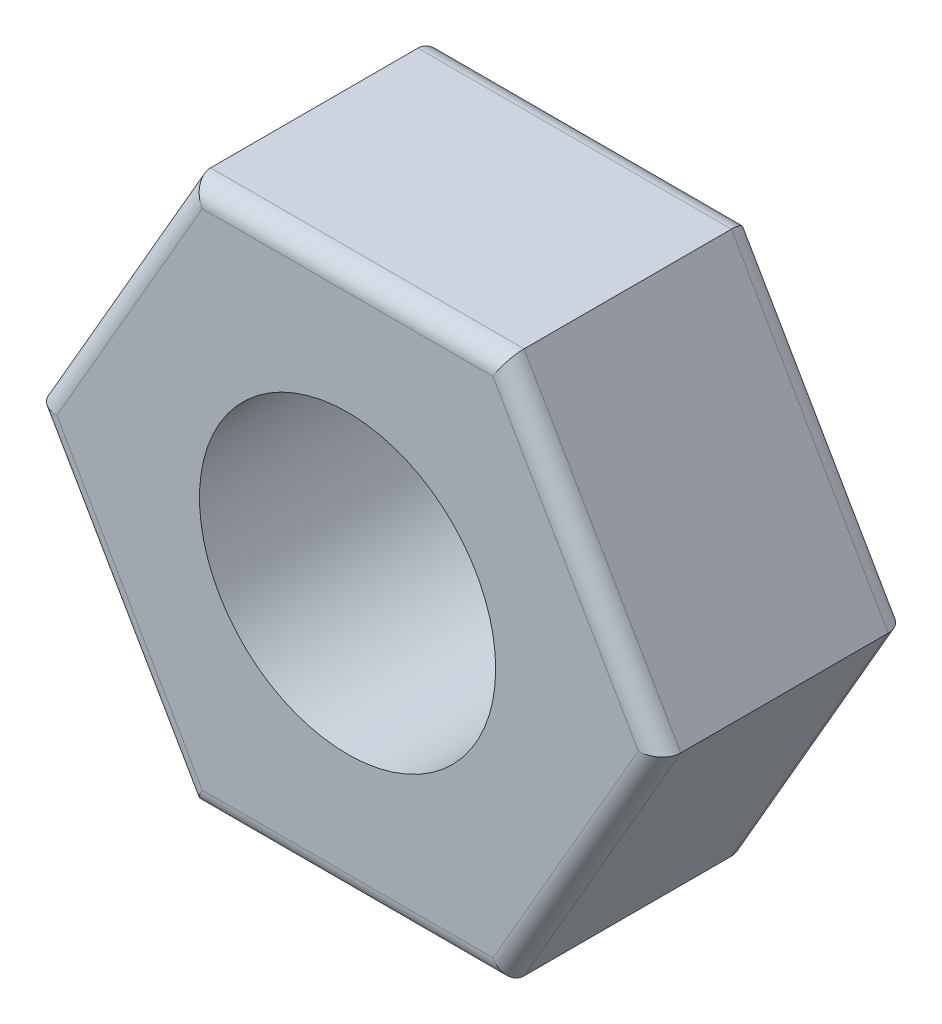
ISO-10303-21;
HEADER;
FILE_DESCRIPTION(('STEP AP214'),'2;1');
FILE_NAME('part.step','',(''),(''),'','','');
FILE_SCHEMA(('AUTOMOTIVE_DESIGN { 1 0 10303 214 1 1 1 1 }'));
ENDSEC;
DATA;
#1=APPLICATION_CONTEXT('core data for automotive mechanical design processes');
#2=APPLICATION_PROTOCOL_DEFINITION('international standard','automotive_design',2000,#1);
#3=PRODUCT_CONTEXT('',#1,'mechanical');
#4=PRODUCT('Part','Part','',(#3));
#5=PRODUCT_RELATED_PRODUCT_CATEGORY('part','',(#4));
#6=PRODUCT_DEFINITION_FORMATION('','',#4);
#7=PRODUCT_DEFINITION_CONTEXT('part definition',#1,'design');
#8=PRODUCT_DEFINITION('design','',#6,#7);
#9=PRODUCT_DEFINITION_SHAPE('','',#8);
#10=(LENGTH_UNIT() NAMED_UNIT(*) SI_UNIT(.MILLI.,.METRE.));
#11=(NAMED_UNIT(*) PLANE_ANGLE_UNIT() SI_UNIT($,.RADIAN.));
#12=(NAMED_UNIT(*) SI_UNIT($,.STERADIAN.) SOLID_ANGLE_UNIT());
#13=UNCERTAINTY_MEASURE_WITH_UNIT(LENGTH_MEASURE(1.E-05),#10,'distance_accuracy_value','');
#14=(GEOMETRIC_REPRESENTATION_CONTEXT(3) GLOBAL_UNCERTAINTY_ASSIGNED_CONTEXT((#13)) GLOBAL_UNIT_ASSIGNED_CONTEXT((#10,
#11,#12)) REPRESENTATION_CONTEXT('',''));
#15=CARTESIAN_POINT('',(0.,0.,0.));
#16=DIRECTION('',(0.,0.,1.));
#17=DIRECTION('',(1.,0.,0.));
#18=AXIS2_PLACEMENT_3D('',#15,#16,#17);
#19=CARTESIAN_POINT('',(0.,0.,2.5));
#20=DIRECTION('',(0.,0.,1.));
#21=DIRECTION('',(1.,0.,0.));
#22=AXIS2_PLACEMENT_3D('',#19,#20,#21);
#23=PLANE('',#22);
#24=DIRECTION('',(-0.5,-0.866025403784439,0.));
#25=VECTOR('',#24,1.);
#26=CARTESIAN_POINT('',(-3.00222139978605,-0.1,2.5));
#27=LINE('',#26,#25);
#28=CARTESIAN_POINT('',(-1.47224318643355,2.55,2.5));
#29=VERTEX_POINT('',#28);
#30=CARTESIAN_POINT('',(-2.94448637286709,0.,2.5));
#31=VERTEX_POINT('',#30);
#32=EDGE_CURVE('E161',#29,#31,#27,.T.);
#33=ORIENTED_EDGE('',*,*,#32,.T.);
#34=DIRECTION('',(0.5,-0.866025403784439,0.));
#35=VECTOR('',#34,1.);
#36=CARTESIAN_POINT('',(-1.41450815951458,-2.65,2.5));
#37=LINE('',#36,#35);
#38=CARTESIAN_POINT('',(-1.47224318643354,-2.55,2.5));
#39=VERTEX_POINT('',#38);
#40=EDGE_CURVE('E140',#31,#39,#37,.T.);
#41=ORIENTED_EDGE('',*,*,#40,.T.);
#42=DIRECTION('',(1.,0.,0.));
#43=VECTOR('',#42,1.);
#44=CARTESIAN_POINT('',(1.58771324027147,-2.55,2.5));
#45=LINE('',#44,#43);
#46=CARTESIAN_POINT('',(1.47224318643354,-2.55,2.5));
#47=VERTEX_POINT('',#46);
#48=EDGE_CURVE('E149',#39,#47,#45,.T.);
#49=ORIENTED_EDGE('',*,*,#48,.T.);
#50=DIRECTION('',(0.5,0.866025403784439,0.));
#51=VECTOR('',#50,1.);
#52=CARTESIAN_POINT('',(3.00222139978605,0.0999999999999998,2.5));
#53=LINE('',#52,#51);
#54=CARTESIAN_POINT('',(2.94448637286709,0.,2.5));
#55=VERTEX_POINT('',#54);
#56=EDGE_CURVE('E156',#47,#55,#53,.T.);
#57=ORIENTED_EDGE('',*,*,#56,.T.);
#58=DIRECTION('',(-0.5,0.866025403784439,0.));
#59=VECTOR('',#58,1.);
#60=CARTESIAN_POINT('',(1.41450815951458,2.65,2.5));
#61=LINE('',#60,#59);
#62=CARTESIAN_POINT('',(1.47224318643354,2.55,2.5));
#63=VERTEX_POINT('',#62);
#64=EDGE_CURVE('E301',#55,#63,#61,.T.);
#65=ORIENTED_EDGE('',*,*,#64,.T.);
#66=DIRECTION('',(-1.,0.,0.));
#67=VECTOR('',#66,1.);
#68=CARTESIAN_POINT('',(-1.58771324027147,2.55,2.5));
#69=LINE('',#68,#67);
#70=EDGE_CURVE('E169',#63,#29,#69,.T.);
#71=ORIENTED_EDGE('',*,*,#70,.T.);
#72=EDGE_LOOP('',(#33,#41,#49,#57,#65,#71));
#73=FACE_BOUND('',#72,.T.);
#74=CARTESIAN_POINT('',(0.,0.,2.5));
#75=DIRECTION('',(0.,0.,1.));
#76=DIRECTION('',(1.,0.,0.));
#77=AXIS2_PLACEMENT_3D('',#74,#75,#76);
#78=CIRCLE('',#77,1.5);
#79=CARTESIAN_POINT('',(1.5,0.,2.5));
#80=VERTEX_POINT('',#79);
#81=EDGE_CURVE('E241',#80,#80,#78,.T.);
#82=ORIENTED_EDGE('',*,*,#81,.F.);
#83=EDGE_LOOP('',(#82));
#84=FACE_BOUND('',#83,.T.);
#85=ADVANCED_FACE('F43',(#73,#84),#23,.T.);
#86=CARTESIAN_POINT('',(0.,0.,0.));
#87=DIRECTION('',(0.,0.,1.));
#88=DIRECTION('',(1.,0.,0.));
#89=AXIS2_PLACEMENT_3D('',#86,#87,#88);
#90=PLANE('',#89);
#91=CARTESIAN_POINT('',(0.,0.,0.));
#92=DIRECTION('',(0.,0.,1.));
#93=DIRECTION('',(1.,0.,0.));
#94=AXIS2_PLACEMENT_3D('',#91,#92,#93);
#95=CIRCLE('',#94,1.7);
#96=CARTESIAN_POINT('',(1.7,0.,0.));
#97=VERTEX_POINT('',#96);
#98=EDGE_CURVE('E53',#97,#97,#95,.T.);
#99=ORIENTED_EDGE('',*,*,#98,.T.);
#100=EDGE_LOOP('',(#99));
#101=FACE_BOUND('',#100,.T.);
#102=DIRECTION('',(-0.5,0.866025403784439,0.));
#103=VECTOR('',#102,1.);
#104=CARTESIAN_POINT('',(2.20836477965032,1.275,0.));
#105=LINE('',#104,#103);
#106=CARTESIAN_POINT('',(1.47224318643354,2.55,0.));
#107=VERTEX_POINT('',#106);
#108=CARTESIAN_POINT('',(2.94448637286709,0.,0.));
#109=VERTEX_POINT('',#108);
#110=EDGE_CURVE('E61',#107,#109,#105,.F.);
#111=ORIENTED_EDGE('',*,*,#110,.T.);
#112=DIRECTION('',(0.5,0.866025403784439,0.));
#113=VECTOR('',#112,1.);
#114=CARTESIAN_POINT('',(2.20836477965032,-1.275,0.));
#115=LINE('',#114,#113);
#116=CARTESIAN_POINT('',(1.47224318643354,-2.55,0.));
#117=VERTEX_POINT('',#116);
#118=EDGE_CURVE('E219',#109,#117,#115,.F.);
#119=ORIENTED_EDGE('',*,*,#118,.T.);
#120=DIRECTION('',(1.,0.,0.));
#121=VECTOR('',#120,1.);
#122=CARTESIAN_POINT('',(0.,-2.55,0.));
#123=LINE('',#122,#121);
#124=CARTESIAN_POINT('',(-1.47224318643355,-2.55,0.));
#125=VERTEX_POINT('',#124);
#126=EDGE_CURVE('E206',#117,#125,#123,.F.);
#127=ORIENTED_EDGE('',*,*,#126,.T.);
#128=DIRECTION('',(0.5,-0.866025403784439,0.));
#129=VECTOR('',#128,1.);
#130=CARTESIAN_POINT('',(-2.20836477965032,-1.275,0.));
#131=LINE('',#130,#129);
#132=CARTESIAN_POINT('',(-2.94448637286709,0.,0.));
#133=VERTEX_POINT('',#132);
#134=EDGE_CURVE('E209',#125,#133,#131,.F.);
#135=ORIENTED_EDGE('',*,*,#134,.T.);
#136=DIRECTION('',(-0.5,-0.866025403784439,0.));
#137=VECTOR('',#136,1.);
#138=CARTESIAN_POINT('',(-2.20836477965032,1.275,0.));
#139=LINE('',#138,#137);
#140=CARTESIAN_POINT('',(-1.47224318643355,2.55,0.));
#141=VERTEX_POINT('',#140);
#142=EDGE_CURVE('E212',#133,#141,#139,.F.);
#143=ORIENTED_EDGE('',*,*,#142,.T.);
#144=DIRECTION('',(-1.,0.,0.));
#145=VECTOR('',#144,1.);
#146=CARTESIAN_POINT('',(0.,2.55,0.));
#147=LINE('',#146,#145);
#148=EDGE_CURVE('E66',#141,#107,#147,.F.);
#149=ORIENTED_EDGE('',*,*,#148,.T.);
#150=EDGE_LOOP('',(#111,#119,#127,#135,#143,#149));
#151=FACE_BOUND('',#150,.T.);
#152=ADVANCED_FACE('F272',(#101,#151),#90,.F.);
#153=CARTESIAN_POINT('',(-1.58771324027147,-2.75,2.5));
#154=DIRECTION('',(0.,1.,0.));
#155=DIRECTION('',(0.,0.,1.));
#156=AXIS2_PLACEMENT_3D('',#153,#154,#155);
#157=PLANE('',#156);
#158=DIRECTION('',(0.,0.,-1.));
#159=VECTOR('',#158,1.);
#160=CARTESIAN_POINT('',(1.58771324027147,-2.75,2.5));
#161=LINE('',#160,#159);
#162=CARTESIAN_POINT('',(1.58771324027147,-2.75,2.3));
#163=VERTEX_POINT('',#162);
#164=CARTESIAN_POINT('',(1.58771324027147,-2.75,0.2));
#165=VERTEX_POINT('',#164);
#166=EDGE_CURVE('E157',#163,#165,#161,.T.);
#167=ORIENTED_EDGE('',*,*,#166,.F.);
#168=DIRECTION('',(1.,0.,0.));
#169=VECTOR('',#168,1.);
#170=CARTESIAN_POINT('',(-1.58771324027147,-2.75,2.3));
#171=LINE('',#170,#169);
#172=CARTESIAN_POINT('',(-1.58771324027147,-2.75,2.3));
#173=VERTEX_POINT('',#172);
#174=EDGE_CURVE('E203',#163,#173,#171,.F.);
#175=ORIENTED_EDGE('',*,*,#174,.T.);
#176=DIRECTION('',(0.,0.,-1.));
#177=VECTOR('',#176,1.);
#178=CARTESIAN_POINT('',(-1.58771324027147,-2.75,2.5));
#179=LINE('',#178,#177);
#180=CARTESIAN_POINT('',(-1.58771324027147,-2.75,0.2));
#181=VERTEX_POINT('',#180);
#182=EDGE_CURVE('E285',#173,#181,#179,.T.);
#183=ORIENTED_EDGE('',*,*,#182,.T.);
#184=DIRECTION('',(1.,0.,0.));
#185=VECTOR('',#184,1.);
#186=CARTESIAN_POINT('',(-1.58771324027147,-2.75,0.2));
#187=LINE('',#186,#185);
#188=EDGE_CURVE('E200',#181,#165,#187,.T.);
#189=ORIENTED_EDGE('',*,*,#188,.T.);
#190=EDGE_LOOP('',(#167,#175,#183,#189));
#191=FACE_BOUND('',#190,.T.);
#192=ADVANCED_FACE('F283',(#191),#157,.F.);
#193=CARTESIAN_POINT('',(1.58771324027147,-2.75,2.5));
#194=DIRECTION('',(-0.866025403784439,0.5,0.));
#195=DIRECTION('',(-0.5,-0.866025403784439,0.));
#196=AXIS2_PLACEMENT_3D('',#193,#194,#195);
#197=PLANE('',#196);
#198=DIRECTION('',(0.,0.,-1.));
#199=VECTOR('',#198,1.);
#200=CARTESIAN_POINT('',(3.17542648054294,0.,2.5));
#201=LINE('',#200,#199);
#202=CARTESIAN_POINT('',(3.17542648054294,0.,2.3));
#203=VERTEX_POINT('',#202);
#204=CARTESIAN_POINT('',(3.17542648054294,0.,0.2));
#205=VERTEX_POINT('',#204);
#206=EDGE_CURVE('E292',#203,#205,#201,.T.);
#207=ORIENTED_EDGE('',*,*,#206,.F.);
#208=DIRECTION('',(0.5,0.866025403784439,0.));
#209=VECTOR('',#208,1.);
#210=CARTESIAN_POINT('',(1.58771324027147,-2.75,2.3));
#211=LINE('',#210,#209);
#212=EDGE_CURVE('E197',#203,#163,#211,.F.);
#213=ORIENTED_EDGE('',*,*,#212,.T.);
#214=ORIENTED_EDGE('',*,*,#166,.T.);
#215=DIRECTION('',(0.5,0.866025403784439,0.));
#216=VECTOR('',#215,1.);
#217=CARTESIAN_POINT('',(1.58771324027147,-2.75,0.2));
#218=LINE('',#217,#216);
#219=EDGE_CURVE('E193',#165,#205,#218,.T.);
#220=ORIENTED_EDGE('',*,*,#219,.T.);
#221=EDGE_LOOP('',(#207,#213,#214,#220));
#222=FACE_BOUND('',#221,.T.);
#223=ADVANCED_FACE('F288',(#222),#197,.F.);
#224=CARTESIAN_POINT('',(3.17542648054294,0.,2.5));
#225=DIRECTION('',(-0.866025403784439,-0.5,0.));
#226=DIRECTION('',(0.5,-0.866025403784439,0.));
#227=AXIS2_PLACEMENT_3D('',#224,#225,#226);
#228=PLANE('',#227);
#229=DIRECTION('',(0.,0.,-1.));
#230=VECTOR('',#229,1.);
#231=CARTESIAN_POINT('',(1.58771324027147,2.75,2.5));
#232=LINE('',#231,#230);
#233=CARTESIAN_POINT('',(1.58771324027147,2.75,2.3));
#234=VERTEX_POINT('',#233);
#235=CARTESIAN_POINT('',(1.58771324027147,2.75,0.2));
#236=VERTEX_POINT('',#235);
#237=EDGE_CURVE('E295',#234,#236,#232,.T.);
#238=ORIENTED_EDGE('',*,*,#237,.F.);
#239=DIRECTION('',(-0.5,0.866025403784439,0.));
#240=VECTOR('',#239,1.);
#241=CARTESIAN_POINT('',(3.17542648054294,0.,2.3));
#242=LINE('',#241,#240);
#243=EDGE_CURVE('E190',#234,#203,#242,.F.);
#244=ORIENTED_EDGE('',*,*,#243,.T.);
#245=ORIENTED_EDGE('',*,*,#206,.T.);
#246=DIRECTION('',(-0.5,0.866025403784439,0.));
#247=VECTOR('',#246,1.);
#248=CARTESIAN_POINT('',(3.17542648054294,0.,0.2));
#249=LINE('',#248,#247);
#250=EDGE_CURVE('E187',#205,#236,#249,.T.);
#251=ORIENTED_EDGE('',*,*,#250,.T.);
#252=EDGE_LOOP('',(#238,#244,#245,#251));
#253=FACE_BOUND('',#252,.T.);
#254=ADVANCED_FACE('F368',(#253),#228,.F.);
#255=CARTESIAN_POINT('',(1.58771324027147,2.75,2.5));
#256=DIRECTION('',(0.,-1.,0.));
#257=DIRECTION('',(1.,0.,0.));
#258=AXIS2_PLACEMENT_3D('',#255,#256,#257);
#259=PLANE('',#258);
#260=DIRECTION('',(0.,0.,-1.));
#261=VECTOR('',#260,1.);
#262=CARTESIAN_POINT('',(-1.58771324027147,2.75,2.5));
#263=LINE('',#262,#261);
#264=CARTESIAN_POINT('',(-1.58771324027147,2.75,2.3));
#265=VERTEX_POINT('',#264);
#266=CARTESIAN_POINT('',(-1.58771324027147,2.75,0.2));
#267=VERTEX_POINT('',#266);
#268=EDGE_CURVE('E324',#265,#267,#263,.T.);
#269=ORIENTED_EDGE('',*,*,#268,.F.);
#270=DIRECTION('',(-1.,0.,0.));
#271=VECTOR('',#270,1.);
#272=CARTESIAN_POINT('',(1.58771324027147,2.75,2.3));
#273=LINE('',#272,#271);
#274=EDGE_CURVE('E184',#265,#234,#273,.F.);
#275=ORIENTED_EDGE('',*,*,#274,.T.);
#276=ORIENTED_EDGE('',*,*,#237,.T.);
#277=DIRECTION('',(-1.,0.,0.));
#278=VECTOR('',#277,1.);
#279=CARTESIAN_POINT('',(1.58771324027147,2.75,0.2));
#280=LINE('',#279,#278);
#281=EDGE_CURVE('E181',#236,#267,#280,.T.);
#282=ORIENTED_EDGE('',*,*,#281,.T.);
#283=EDGE_LOOP('',(#269,#275,#276,#282));
#284=FACE_BOUND('',#283,.T.);
#285=ADVANCED_FACE('F335',(#284),#259,.F.);
#286=CARTESIAN_POINT('',(-1.58771324027147,2.75,2.5));
#287=DIRECTION('',(0.866025403784439,-0.5,0.));
#288=DIRECTION('',(0.5,0.866025403784439,0.));
#289=AXIS2_PLACEMENT_3D('',#286,#287,#288);
#290=PLANE('',#289);
#291=DIRECTION('',(0.,0.,-1.));
#292=VECTOR('',#291,1.);
#293=CARTESIAN_POINT('',(-3.17542648054294,0.,2.5));
#294=LINE('',#293,#292);
#295=CARTESIAN_POINT('',(-3.17542648054294,0.,2.3));
#296=VERTEX_POINT('',#295);
#297=CARTESIAN_POINT('',(-3.17542648054294,0.,0.2));
#298=VERTEX_POINT('',#297);
#299=EDGE_CURVE('E321',#296,#298,#294,.T.);
#300=ORIENTED_EDGE('',*,*,#299,.F.);
#301=DIRECTION('',(-0.5,-0.866025403784439,0.));
#302=VECTOR('',#301,1.);
#303=CARTESIAN_POINT('',(-1.58771324027147,2.75,2.3));
#304=LINE('',#303,#302);
#305=EDGE_CURVE('E178',#296,#265,#304,.F.);
#306=ORIENTED_EDGE('',*,*,#305,.T.);
#307=ORIENTED_EDGE('',*,*,#268,.T.);
#308=DIRECTION('',(-0.5,-0.866025403784439,0.));
#309=VECTOR('',#308,1.);
#310=CARTESIAN_POINT('',(-1.58771324027147,2.75,0.2));
#311=LINE('',#310,#309);
#312=EDGE_CURVE('E175',#267,#298,#311,.T.);
#313=ORIENTED_EDGE('',*,*,#312,.T.);
#314=EDGE_LOOP('',(#300,#306,#307,#313));
#315=FACE_BOUND('',#314,.T.);
#316=ADVANCED_FACE('F322',(#315),#290,.F.);
#317=CARTESIAN_POINT('',(-3.17542648054294,0.,2.5));
#318=DIRECTION('',(0.866025403784439,0.5,0.));
#319=DIRECTION('',(-0.5,0.866025403784439,0.));
#320=AXIS2_PLACEMENT_3D('',#317,#318,#319);
#321=PLANE('',#320);
#322=ORIENTED_EDGE('',*,*,#182,.F.);
#323=DIRECTION('',(0.5,-0.866025403784439,0.));
#324=VECTOR('',#323,1.);
#325=CARTESIAN_POINT('',(-3.17542648054294,0.,2.3));
#326=LINE('',#325,#324);
#327=EDGE_CURVE('E142',#173,#296,#326,.F.);
#328=ORIENTED_EDGE('',*,*,#327,.T.);
#329=ORIENTED_EDGE('',*,*,#299,.T.);
#330=DIRECTION('',(0.5,-0.866025403784439,0.));
#331=VECTOR('',#330,1.);
#332=CARTESIAN_POINT('',(-3.17542648054294,0.,0.2));
#333=LINE('',#332,#331);
#334=EDGE_CURVE('E164',#298,#181,#333,.T.);
#335=ORIENTED_EDGE('',*,*,#334,.T.);
#336=EDGE_LOOP('',(#322,#328,#329,#335));
#337=FACE_BOUND('',#336,.T.);
#338=ADVANCED_FACE('F320',(#337),#321,.F.);
#339=CARTESIAN_POINT('',(0.,0.,2.5));
#340=DIRECTION('',(0.,0.,-1.));
#341=DIRECTION('',(-1.,0.,0.));
#342=AXIS2_PLACEMENT_3D('',#339,#340,#341);
#343=CYLINDRICAL_SURFACE('',#342,1.5);
#344=CARTESIAN_POINT('',(0.,0.,0.2));
#345=DIRECTION('',(0.,0.,1.));
#346=DIRECTION('',(1.,0.,0.));
#347=AXIS2_PLACEMENT_3D('',#344,#345,#346);
#348=CIRCLE('',#347,1.5);
#349=CARTESIAN_POINT('',(1.5,0.,0.2));
#350=VERTEX_POINT('',#349);
#351=EDGE_CURVE('E11',#350,#350,#348,.F.);
#352=ORIENTED_EDGE('',*,*,#351,.T.);
#353=EDGE_LOOP('',(#352));
#354=FACE_BOUND('',#353,.T.);
#355=ORIENTED_EDGE('',*,*,#81,.T.);
#356=EDGE_LOOP('',(#355));
#357=FACE_BOUND('',#356,.T.);
#358=ADVANCED_FACE('F360',(#354,#357),#343,.F.);
#359=CARTESIAN_POINT('',(2.20836477965032,1.275,2.3));
#360=DIRECTION('',(0.5,-0.866025403784439,0.));
#361=DIRECTION('',(0.866025403784439,0.5,0.));
#362=AXIS2_PLACEMENT_3D('',#359,#360,#361);
#363=CYLINDRICAL_SURFACE('',#362,0.2);
#364=CARTESIAN_POINT('',(2.94448637286709,0.,2.3));
#365=DIRECTION('',(0.,-1.,0.));
#366=DIRECTION('',(-1.,0.,0.));
#367=AXIS2_PLACEMENT_3D('',#364,#365,#366);
#368=ELLIPSE('',#367,0.23094010767585,0.2);
#369=EDGE_CURVE('E233',#203,#55,#368,.T.);
#370=ORIENTED_EDGE('',*,*,#369,.F.);
#371=ORIENTED_EDGE('',*,*,#243,.F.);
#372=CARTESIAN_POINT('',(1.47224318643354,2.55,2.3));
#373=DIRECTION('',(0.866025403784439,-0.5,0.));
#374=DIRECTION('',(-0.5,-0.866025403784439,0.));
#375=AXIS2_PLACEMENT_3D('',#372,#373,#374);
#376=ELLIPSE('',#375,0.23094010767585,0.2);
#377=EDGE_CURVE('E237',#63,#234,#376,.F.);
#378=ORIENTED_EDGE('',*,*,#377,.F.);
#379=ORIENTED_EDGE('',*,*,#64,.F.);
#380=EDGE_LOOP('',(#370,#371,#378,#379));
#381=FACE_BOUND('',#380,.T.);
#382=ADVANCED_FACE('F388',(#381),#363,.T.);
#383=CARTESIAN_POINT('',(0.,2.55,2.3));
#384=DIRECTION('',(1.,0.,0.));
#385=DIRECTION('',(0.,1.,0.));
#386=AXIS2_PLACEMENT_3D('',#383,#384,#385);
#387=CYLINDRICAL_SURFACE('',#386,0.2);
#388=ORIENTED_EDGE('',*,*,#377,.T.);
#389=ORIENTED_EDGE('',*,*,#274,.F.);
#390=CARTESIAN_POINT('',(-1.47224318643354,2.55,2.3));
#391=DIRECTION('',(0.866025403784439,0.5,0.));
#392=DIRECTION('',(0.5,-0.866025403784439,0.));
#393=AXIS2_PLACEMENT_3D('',#390,#391,#392);
#394=ELLIPSE('',#393,0.23094010767585,0.2);
#395=EDGE_CURVE('E229',#29,#265,#394,.F.);
#396=ORIENTED_EDGE('',*,*,#395,.F.);
#397=ORIENTED_EDGE('',*,*,#70,.F.);
#398=EDGE_LOOP('',(#388,#389,#396,#397));
#399=FACE_BOUND('',#398,.T.);
#400=ADVANCED_FACE('F310',(#399),#387,.T.);
#401=CARTESIAN_POINT('',(2.20836477965032,-1.275,2.3));
#402=DIRECTION('',(-0.5,-0.866025403784439,0.));
#403=DIRECTION('',(0.866025403784439,-0.5,0.));
#404=AXIS2_PLACEMENT_3D('',#401,#402,#403);
#405=CYLINDRICAL_SURFACE('',#404,0.2);
#406=ORIENTED_EDGE('',*,*,#369,.T.);
#407=ORIENTED_EDGE('',*,*,#56,.F.);
#408=CARTESIAN_POINT('',(1.47224318643354,-2.55,2.3));
#409=DIRECTION('',(-0.866025403784439,-0.5,0.));
#410=DIRECTION('',(-0.5,0.866025403784439,0.));
#411=AXIS2_PLACEMENT_3D('',#408,#409,#410);
#412=ELLIPSE('',#411,0.23094010767585,0.2);
#413=EDGE_CURVE('E152',#163,#47,#412,.T.);
#414=ORIENTED_EDGE('',*,*,#413,.F.);
#415=ORIENTED_EDGE('',*,*,#212,.F.);
#416=EDGE_LOOP('',(#406,#407,#414,#415));
#417=FACE_BOUND('',#416,.T.);
#418=ADVANCED_FACE('F382',(#417),#405,.T.);
#419=CARTESIAN_POINT('',(-2.20836477965032,1.275,2.3));
#420=DIRECTION('',(0.5,0.866025403784439,0.));
#421=DIRECTION('',(-0.866025403784439,0.5,0.));
#422=AXIS2_PLACEMENT_3D('',#419,#420,#421);
#423=CYLINDRICAL_SURFACE('',#422,0.2);
#424=ORIENTED_EDGE('',*,*,#395,.T.);
#425=ORIENTED_EDGE('',*,*,#305,.F.);
#426=CARTESIAN_POINT('',(-2.94448637286709,0.,2.3));
#427=DIRECTION('',(0.,1.,0.));
#428=DIRECTION('',(1.,0.,0.));
#429=AXIS2_PLACEMENT_3D('',#426,#427,#428);
#430=ELLIPSE('',#429,0.23094010767585,0.2);
#431=EDGE_CURVE('E146',#31,#296,#430,.F.);
#432=ORIENTED_EDGE('',*,*,#431,.F.);
#433=ORIENTED_EDGE('',*,*,#32,.F.);
#434=EDGE_LOOP('',(#424,#425,#432,#433));
#435=FACE_BOUND('',#434,.T.);
#436=ADVANCED_FACE('F313',(#435),#423,.T.);
#437=CARTESIAN_POINT('',(0.,-2.55,2.3));
#438=DIRECTION('',(-1.,0.,0.));
#439=DIRECTION('',(0.,0.,1.));
#440=AXIS2_PLACEMENT_3D('',#437,#438,#439);
#441=CYLINDRICAL_SURFACE('',#440,0.2);
#442=ORIENTED_EDGE('',*,*,#413,.T.);
#443=ORIENTED_EDGE('',*,*,#48,.F.);
#444=CARTESIAN_POINT('',(-1.47224318643354,-2.55,2.3));
#445=DIRECTION('',(-0.866025403784439,0.5,0.));
#446=DIRECTION('',(-0.5,-0.866025403784439,0.));
#447=AXIS2_PLACEMENT_3D('',#444,#445,#446);
#448=ELLIPSE('',#447,0.23094010767585,0.2);
#449=EDGE_CURVE('E136',#173,#39,#448,.T.);
#450=ORIENTED_EDGE('',*,*,#449,.F.);
#451=ORIENTED_EDGE('',*,*,#174,.F.);
#452=EDGE_LOOP('',(#442,#443,#450,#451));
#453=FACE_BOUND('',#452,.T.);
#454=ADVANCED_FACE('F150',(#453),#441,.T.);
#455=CARTESIAN_POINT('',(-2.20836477965032,-1.275,2.3));
#456=DIRECTION('',(-0.5,0.866025403784439,0.));
#457=DIRECTION('',(-0.866025403784439,-0.5,0.));
#458=AXIS2_PLACEMENT_3D('',#455,#456,#457);
#459=CYLINDRICAL_SURFACE('',#458,0.2);
#460=ORIENTED_EDGE('',*,*,#431,.T.);
#461=ORIENTED_EDGE('',*,*,#327,.F.);
#462=ORIENTED_EDGE('',*,*,#449,.T.);
#463=ORIENTED_EDGE('',*,*,#40,.F.);
#464=EDGE_LOOP('',(#460,#461,#462,#463));
#465=FACE_BOUND('',#464,.T.);
#466=ADVANCED_FACE('F138',(#465),#459,.T.);
#467=CARTESIAN_POINT('',(0.,0.,0.2));
#468=DIRECTION('',(0.,0.,1.));
#469=DIRECTION('',(1.,0.,0.));
#470=AXIS2_PLACEMENT_3D('',#467,#468,#469);
#471=TOROIDAL_SURFACE('',#470,1.7,0.2);
#472=ORIENTED_EDGE('',*,*,#351,.F.);
#473=EDGE_LOOP('',(#472));
#474=FACE_BOUND('',#473,.T.);
#475=ORIENTED_EDGE('',*,*,#98,.F.);
#476=EDGE_LOOP('',(#475));
#477=FACE_BOUND('',#476,.T.);
#478=ADVANCED_FACE('F377',(#474,#477),#471,.T.);
#479=CARTESIAN_POINT('',(-1.41450815951458,2.65,0.2));
#480=DIRECTION('',(-0.5,-0.866025403784439,0.));
#481=DIRECTION('',(0.866025403784439,-0.5,0.));
#482=AXIS2_PLACEMENT_3D('',#479,#480,#481);
#483=CYLINDRICAL_SURFACE('',#482,0.2);
#484=CARTESIAN_POINT('',(-1.47224318643355,2.55,0.2));
#485=DIRECTION('',(-0.866025403784439,-0.5,0.));
#486=DIRECTION('',(0.5,-0.866025403784439,0.));
#487=AXIS2_PLACEMENT_3D('',#484,#485,#486);
#488=ELLIPSE('',#487,0.23094010767585,0.2);
#489=EDGE_CURVE('E255',#141,#267,#488,.F.);
#490=ORIENTED_EDGE('',*,*,#489,.F.);
#491=ORIENTED_EDGE('',*,*,#142,.F.);
#492=CARTESIAN_POINT('',(-2.94448637286709,0.,0.2));
#493=DIRECTION('',(0.,-1.,0.));
#494=DIRECTION('',(1.,0.,0.));
#495=AXIS2_PLACEMENT_3D('',#492,#493,#494);
#496=ELLIPSE('',#495,0.23094010767585,0.2);
#497=EDGE_CURVE('E47',#298,#133,#496,.T.);
#498=ORIENTED_EDGE('',*,*,#497,.F.);
#499=ORIENTED_EDGE('',*,*,#312,.F.);
#500=EDGE_LOOP('',(#490,#491,#498,#499));
#501=FACE_BOUND('',#500,.T.);
#502=ADVANCED_FACE('F45',(#501),#483,.T.);
#503=CARTESIAN_POINT('',(-3.00222139978605,0.1,0.2));
#504=DIRECTION('',(0.5,-0.866025403784439,0.));
#505=DIRECTION('',(0.866025403784439,0.5,0.));
#506=AXIS2_PLACEMENT_3D('',#503,#504,#505);
#507=CYLINDRICAL_SURFACE('',#506,0.2);
#508=ORIENTED_EDGE('',*,*,#497,.T.);
#509=ORIENTED_EDGE('',*,*,#134,.F.);
#510=CARTESIAN_POINT('',(-1.47224318643354,-2.55,0.2));
#511=DIRECTION('',(0.866025403784439,-0.5,0.));
#512=DIRECTION('',(0.5,0.866025403784439,0.));
#513=AXIS2_PLACEMENT_3D('',#510,#511,#512);
#514=ELLIPSE('',#513,0.23094010767585,0.2);
#515=EDGE_CURVE('E252',#181,#125,#514,.T.);
#516=ORIENTED_EDGE('',*,*,#515,.F.);
#517=ORIENTED_EDGE('',*,*,#334,.F.);
#518=EDGE_LOOP('',(#508,#509,#516,#517));
#519=FACE_BOUND('',#518,.T.);
#520=ADVANCED_FACE('F267',(#519),#507,.T.);
#521=CARTESIAN_POINT('',(1.58771324027147,2.55,0.2));
#522=DIRECTION('',(-1.,0.,0.));
#523=DIRECTION('',(0.,-1.,0.));
#524=AXIS2_PLACEMENT_3D('',#521,#522,#523);
#525=CYLINDRICAL_SURFACE('',#524,0.2);
#526=ORIENTED_EDGE('',*,*,#489,.T.);
#527=ORIENTED_EDGE('',*,*,#281,.F.);
#528=CARTESIAN_POINT('',(1.47224318643354,2.55,0.2));
#529=DIRECTION('',(-0.866025403784439,0.5,0.));
#530=DIRECTION('',(-0.5,-0.866025403784439,0.));
#531=AXIS2_PLACEMENT_3D('',#528,#529,#530);
#532=ELLIPSE('',#531,0.23094010767585,0.2);
#533=EDGE_CURVE('E248',#107,#236,#532,.F.);
#534=ORIENTED_EDGE('',*,*,#533,.F.);
#535=ORIENTED_EDGE('',*,*,#148,.F.);
#536=EDGE_LOOP('',(#526,#527,#534,#535));
#537=FACE_BOUND('',#536,.T.);
#538=ADVANCED_FACE('F338',(#537),#525,.T.);
#539=CARTESIAN_POINT('',(-1.58771324027147,-2.55,0.2));
#540=DIRECTION('',(1.,0.,0.));
#541=DIRECTION('',(0.,0.,-1.));
#542=AXIS2_PLACEMENT_3D('',#539,#540,#541);
#543=CYLINDRICAL_SURFACE('',#542,0.2);
#544=ORIENTED_EDGE('',*,*,#515,.T.);
#545=ORIENTED_EDGE('',*,*,#126,.F.);
#546=CARTESIAN_POINT('',(1.47224318643354,-2.55,0.2));
#547=DIRECTION('',(0.866025403784439,0.5,0.));
#548=DIRECTION('',(0.5,-0.866025403784439,0.));
#549=AXIS2_PLACEMENT_3D('',#546,#547,#548);
#550=ELLIPSE('',#549,0.23094010767585,0.2);
#551=EDGE_CURVE('E245',#165,#117,#550,.T.);
#552=ORIENTED_EDGE('',*,*,#551,.F.);
#553=ORIENTED_EDGE('',*,*,#188,.F.);
#554=EDGE_LOOP('',(#544,#545,#552,#553));
#555=FACE_BOUND('',#554,.T.);
#556=ADVANCED_FACE('F276',(#555),#543,.T.);
#557=CARTESIAN_POINT('',(3.00222139978605,-0.1,0.2));
#558=DIRECTION('',(-0.5,0.866025403784439,0.));
#559=DIRECTION('',(-0.866025403784439,-0.5,0.));
#560=AXIS2_PLACEMENT_3D('',#557,#558,#559);
#561=CYLINDRICAL_SURFACE('',#560,0.2);
#562=ORIENTED_EDGE('',*,*,#533,.T.);
#563=ORIENTED_EDGE('',*,*,#250,.F.);
#564=CARTESIAN_POINT('',(2.94448637286709,0.,0.2));
#565=DIRECTION('',(0.,1.,0.));
#566=DIRECTION('',(-1.,0.,0.));
#567=AXIS2_PLACEMENT_3D('',#564,#565,#566);
#568=ELLIPSE('',#567,0.23094010767585,0.2);
#569=EDGE_CURVE('E242',#109,#205,#568,.F.);
#570=ORIENTED_EDGE('',*,*,#569,.F.);
#571=ORIENTED_EDGE('',*,*,#110,.F.);
#572=EDGE_LOOP('',(#562,#563,#570,#571));
#573=FACE_BOUND('',#572,.T.);
#574=ADVANCED_FACE('F341',(#573),#561,.T.);
#575=CARTESIAN_POINT('',(1.41450815951458,-2.65,0.2));
#576=DIRECTION('',(0.5,0.866025403784439,0.));
#577=DIRECTION('',(-0.866025403784439,0.5,0.));
#578=AXIS2_PLACEMENT_3D('',#575,#576,#577);
#579=CYLINDRICAL_SURFACE('',#578,0.2);
#580=ORIENTED_EDGE('',*,*,#551,.T.);
#581=ORIENTED_EDGE('',*,*,#118,.F.);
#582=ORIENTED_EDGE('',*,*,#569,.T.);
#583=ORIENTED_EDGE('',*,*,#219,.F.);
#584=EDGE_LOOP('',(#580,#581,#582,#583));
#585=FACE_BOUND('',#584,.T.);
#586=ADVANCED_FACE('F344',(#585),#579,.T.);
#587=CLOSED_SHELL('',(#85,#152,#192,#223,#254,#285,#316,#338,#358,#382,#400,#418,#436,#454,#466,
#478,#502,#520,#538,#556,#574,#586));
#588=MANIFOLD_SOLID_BREP('B2',#587);
#589=ADVANCED_BREP_SHAPE_REPRESENTATION('',(#18,#588),#14);
#590=SHAPE_DEFINITION_REPRESENTATION(#9,#589);
ENDSEC;
END-ISO-10303-21;
